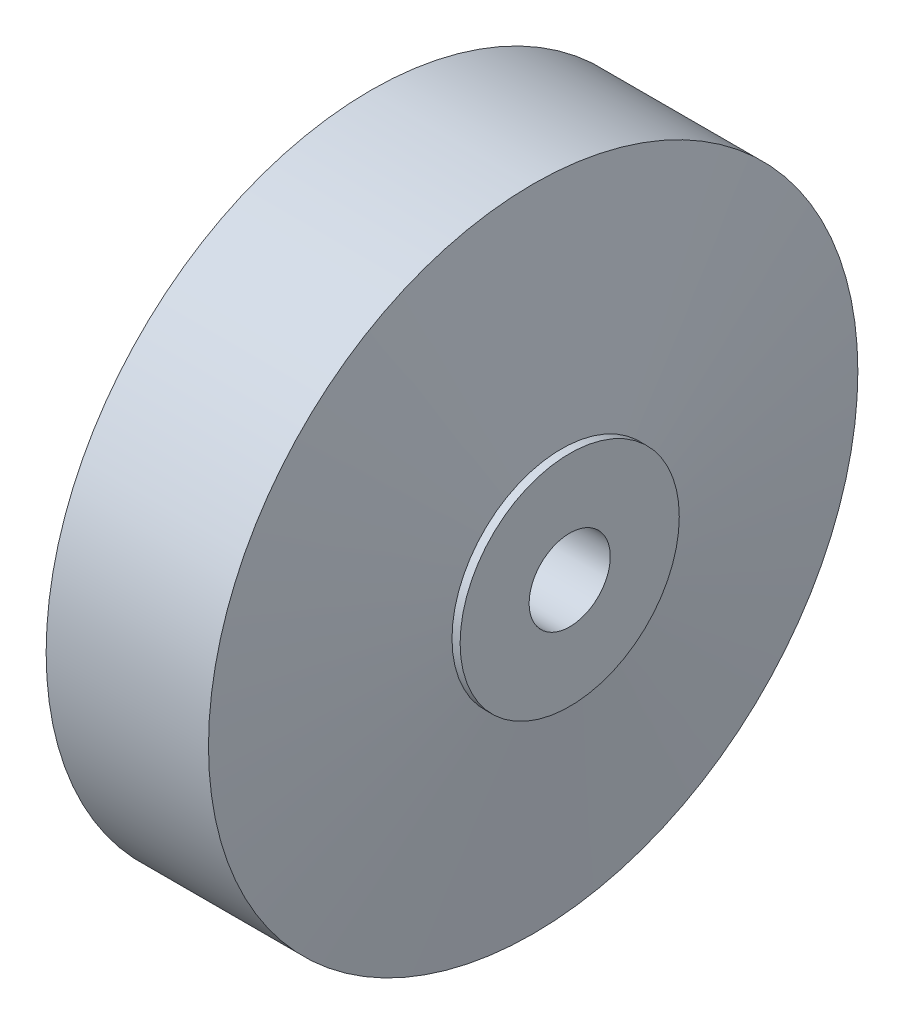
ISO-10303-21;
HEADER;
FILE_DESCRIPTION(('STEP AP214'),'2;1');
FILE_NAME('part.step','',(''),(''),'','','');
FILE_SCHEMA(('AUTOMOTIVE_DESIGN { 1 0 10303 214 1 1 1 1 }'));
ENDSEC;
DATA;
#1=APPLICATION_CONTEXT('core data for automotive mechanical design processes');
#2=APPLICATION_PROTOCOL_DEFINITION('international standard','automotive_design',2000,#1);
#3=PRODUCT_CONTEXT('',#1,'mechanical');
#4=PRODUCT('Part','Part','',(#3));
#5=PRODUCT_RELATED_PRODUCT_CATEGORY('part','',(#4));
#6=PRODUCT_DEFINITION_FORMATION('','',#4);
#7=PRODUCT_DEFINITION_CONTEXT('part definition',#1,'design');
#8=PRODUCT_DEFINITION('design','',#6,#7);
#9=PRODUCT_DEFINITION_SHAPE('','',#8);
#10=(LENGTH_UNIT() NAMED_UNIT(*) SI_UNIT(.MILLI.,.METRE.));
#11=(NAMED_UNIT(*) PLANE_ANGLE_UNIT() SI_UNIT($,.RADIAN.));
#12=(NAMED_UNIT(*) SI_UNIT($,.STERADIAN.) SOLID_ANGLE_UNIT());
#13=UNCERTAINTY_MEASURE_WITH_UNIT(LENGTH_MEASURE(1.E-05),#10,'distance_accuracy_value','');
#14=(GEOMETRIC_REPRESENTATION_CONTEXT(3) GLOBAL_UNCERTAINTY_ASSIGNED_CONTEXT((#13)) GLOBAL_UNIT_ASSIGNED_CONTEXT((#10,
#11,#12)) REPRESENTATION_CONTEXT('',''));
#15=CARTESIAN_POINT('',(0.,0.,0.));
#16=DIRECTION('',(0.,0.,1.));
#17=DIRECTION('',(1.,0.,0.));
#18=AXIS2_PLACEMENT_3D('',#15,#16,#17);
#19=CARTESIAN_POINT('',(-29.,27.,0.));
#20=DIRECTION('',(1.,0.,0.));
#21=DIRECTION('',(0.,0.,-1.));
#22=AXIS2_PLACEMENT_3D('',#19,#20,#21);
#23=PLANE('',#22);
#24=CARTESIAN_POINT('',(-29.,0.,0.));
#25=DIRECTION('',(-1.,0.,0.));
#26=DIRECTION('',(0.,0.,1.));
#27=AXIS2_PLACEMENT_3D('',#24,#25,#26);
#28=CIRCLE('',#27,9.99999999999999);
#29=CARTESIAN_POINT('',(-29.,0.,9.99999999999999));
#30=VERTEX_POINT('',#29);
#31=EDGE_CURVE('E59',#30,#30,#28,.T.);
#32=ORIENTED_EDGE('',*,*,#31,.F.);
#33=EDGE_LOOP('',(#32));
#34=FACE_BOUND('',#33,.T.);
#35=CARTESIAN_POINT('',(-29.,0.,0.));
#36=DIRECTION('',(-1.,0.,0.));
#37=DIRECTION('',(0.,0.,1.));
#38=AXIS2_PLACEMENT_3D('',#35,#36,#37);
#39=CIRCLE('',#38,27.);
#40=CARTESIAN_POINT('',(-29.,0.,27.));
#41=VERTEX_POINT('',#40);
#42=EDGE_CURVE('E10',#41,#41,#39,.T.);
#43=ORIENTED_EDGE('',*,*,#42,.T.);
#44=EDGE_LOOP('',(#43));
#45=FACE_BOUND('',#44,.T.);
#46=ADVANCED_FACE('F31',(#34,#45),#23,.F.);
#47=CARTESIAN_POINT('',(0.,0.,0.));
#48=DIRECTION('',(-1.,0.,0.));
#49=DIRECTION('',(0.,0.,1.));
#50=AXIS2_PLACEMENT_3D('',#47,#48,#49);
#51=CYLINDRICAL_SURFACE('',#50,27.);
#52=ORIENTED_EDGE('',*,*,#42,.F.);
#53=EDGE_LOOP('',(#52));
#54=FACE_BOUND('',#53,.T.);
#55=CARTESIAN_POINT('',(-27.,0.,0.));
#56=DIRECTION('',(-1.,0.,0.));
#57=DIRECTION('',(0.,0.,1.));
#58=AXIS2_PLACEMENT_3D('',#55,#56,#57);
#59=CIRCLE('',#58,27.);
#60=CARTESIAN_POINT('',(-27.,0.,27.));
#61=VERTEX_POINT('',#60);
#62=EDGE_CURVE('E37',#61,#61,#59,.T.);
#63=ORIENTED_EDGE('',*,*,#62,.T.);
#64=EDGE_LOOP('',(#63));
#65=FACE_BOUND('',#64,.T.);
#66=ADVANCED_FACE('F66',(#54,#65),#51,.T.);
#67=CARTESIAN_POINT('',(-20.,0.,0.));
#68=DIRECTION('',(1.,0.,0.));
#69=DIRECTION('',(0.,0.,-1.));
#70=AXIS2_PLACEMENT_3D('',#67,#68,#69);
#71=CONICAL_SURFACE('',#70,80.,1.43948088781181);
#72=ORIENTED_EDGE('',*,*,#62,.F.);
#73=EDGE_LOOP('',(#72));
#74=FACE_BOUND('',#73,.T.);
#75=CARTESIAN_POINT('',(-20.,0.,0.));
#76=DIRECTION('',(-1.,0.,0.));
#77=DIRECTION('',(0.,0.,1.));
#78=AXIS2_PLACEMENT_3D('',#75,#76,#77);
#79=CIRCLE('',#78,80.);
#80=CARTESIAN_POINT('',(-20.,0.,80.));
#81=VERTEX_POINT('',#80);
#82=EDGE_CURVE('E41',#81,#81,#79,.T.);
#83=ORIENTED_EDGE('',*,*,#82,.T.);
#84=EDGE_LOOP('',(#83));
#85=FACE_BOUND('',#84,.T.);
#86=ADVANCED_FACE('F70',(#74,#85),#71,.T.);
#87=CARTESIAN_POINT('',(0.,0.,0.));
#88=DIRECTION('',(-1.,0.,0.));
#89=DIRECTION('',(0.,0.,1.));
#90=AXIS2_PLACEMENT_3D('',#87,#88,#89);
#91=CYLINDRICAL_SURFACE('',#90,80.);
#92=ORIENTED_EDGE('',*,*,#82,.F.);
#93=EDGE_LOOP('',(#92));
#94=FACE_BOUND('',#93,.T.);
#95=CARTESIAN_POINT('',(20.,0.,0.));
#96=DIRECTION('',(-1.,0.,0.));
#97=DIRECTION('',(0.,0.,1.));
#98=AXIS2_PLACEMENT_3D('',#95,#96,#97);
#99=CIRCLE('',#98,80.);
#100=CARTESIAN_POINT('',(20.,0.,80.));
#101=VERTEX_POINT('',#100);
#102=EDGE_CURVE('E45',#101,#101,#99,.T.);
#103=ORIENTED_EDGE('',*,*,#102,.T.);
#104=EDGE_LOOP('',(#103));
#105=FACE_BOUND('',#104,.T.);
#106=ADVANCED_FACE('F75',(#94,#105),#91,.T.);
#107=CARTESIAN_POINT('',(27.,0.,0.));
#108=DIRECTION('',(-1.,0.,0.));
#109=DIRECTION('',(0.,0.,1.));
#110=AXIS2_PLACEMENT_3D('',#107,#108,#109);
#111=CONICAL_SURFACE('',#110,27.,1.43948088781181);
#112=ORIENTED_EDGE('',*,*,#102,.F.);
#113=EDGE_LOOP('',(#112));
#114=FACE_BOUND('',#113,.T.);
#115=CARTESIAN_POINT('',(27.,0.,0.));
#116=DIRECTION('',(-1.,0.,0.));
#117=DIRECTION('',(0.,0.,1.));
#118=AXIS2_PLACEMENT_3D('',#115,#116,#117);
#119=CIRCLE('',#118,27.);
#120=CARTESIAN_POINT('',(27.,0.,27.));
#121=VERTEX_POINT('',#120);
#122=EDGE_CURVE('E50',#121,#121,#119,.T.);
#123=ORIENTED_EDGE('',*,*,#122,.T.);
#124=EDGE_LOOP('',(#123));
#125=FACE_BOUND('',#124,.T.);
#126=ADVANCED_FACE('F81',(#114,#125),#111,.T.);
#127=CARTESIAN_POINT('',(0.,0.,0.));
#128=DIRECTION('',(-1.,0.,0.));
#129=DIRECTION('',(0.,0.,1.));
#130=AXIS2_PLACEMENT_3D('',#127,#128,#129);
#131=CYLINDRICAL_SURFACE('',#130,27.);
#132=ORIENTED_EDGE('',*,*,#122,.F.);
#133=EDGE_LOOP('',(#132));
#134=FACE_BOUND('',#133,.T.);
#135=CARTESIAN_POINT('',(29.,0.,0.));
#136=DIRECTION('',(-1.,0.,0.));
#137=DIRECTION('',(0.,0.,1.));
#138=AXIS2_PLACEMENT_3D('',#135,#136,#137);
#139=CIRCLE('',#138,27.);
#140=CARTESIAN_POINT('',(29.,0.,27.));
#141=VERTEX_POINT('',#140);
#142=EDGE_CURVE('E53',#141,#141,#139,.T.);
#143=ORIENTED_EDGE('',*,*,#142,.T.);
#144=EDGE_LOOP('',(#143));
#145=FACE_BOUND('',#144,.T.);
#146=ADVANCED_FACE('F85',(#134,#145),#131,.T.);
#147=CARTESIAN_POINT('',(29.,27.,0.));
#148=DIRECTION('',(-1.,0.,0.));
#149=DIRECTION('',(0.,0.,1.));
#150=AXIS2_PLACEMENT_3D('',#147,#148,#149);
#151=PLANE('',#150);
#152=ORIENTED_EDGE('',*,*,#142,.F.);
#153=EDGE_LOOP('',(#152));
#154=FACE_BOUND('',#153,.T.);
#155=CARTESIAN_POINT('',(29.,0.,0.));
#156=DIRECTION('',(-1.,0.,0.));
#157=DIRECTION('',(0.,0.,1.));
#158=AXIS2_PLACEMENT_3D('',#155,#156,#157);
#159=CIRCLE('',#158,9.99999999999999);
#160=CARTESIAN_POINT('',(29.,0.,9.99999999999999));
#161=VERTEX_POINT('',#160);
#162=EDGE_CURVE('E56',#161,#161,#159,.T.);
#163=ORIENTED_EDGE('',*,*,#162,.T.);
#164=EDGE_LOOP('',(#163));
#165=FACE_BOUND('',#164,.T.);
#166=ADVANCED_FACE('F89',(#154,#165),#151,.F.);
#167=CARTESIAN_POINT('',(0.,0.,0.));
#168=DIRECTION('',(-1.,0.,0.));
#169=DIRECTION('',(0.,0.,1.));
#170=AXIS2_PLACEMENT_3D('',#167,#168,#169);
#171=CYLINDRICAL_SURFACE('',#170,9.99999999999999);
#172=ORIENTED_EDGE('',*,*,#162,.F.);
#173=EDGE_LOOP('',(#172));
#174=FACE_BOUND('',#173,.T.);
#175=ORIENTED_EDGE('',*,*,#31,.T.);
#176=EDGE_LOOP('',(#175));
#177=FACE_BOUND('',#176,.T.);
#178=ADVANCED_FACE('F63',(#174,#177),#171,.F.);
#179=CLOSED_SHELL('',(#46,#66,#86,#106,#126,#146,#166,#178));
#180=MANIFOLD_SOLID_BREP('B2',#179);
#181=ADVANCED_BREP_SHAPE_REPRESENTATION('',(#18,#180),#14);
#182=SHAPE_DEFINITION_REPRESENTATION(#9,#181);
ENDSEC;
END-ISO-10303-21;
